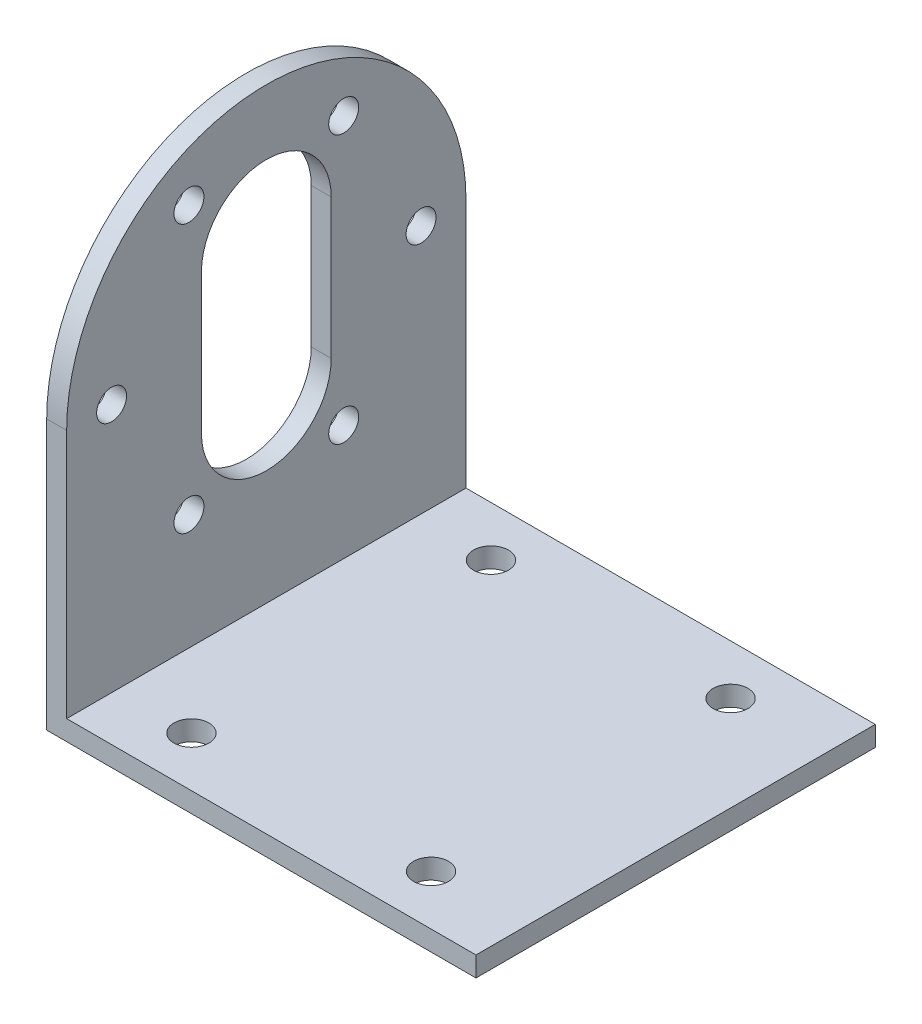
ISO-10303-21;
HEADER;
FILE_DESCRIPTION(('STEP AP214'),'2;1');
FILE_NAME('part.step','',(''),(''),'','','');
FILE_SCHEMA(('AUTOMOTIVE_DESIGN { 1 0 10303 214 1 1 1 1 }'));
ENDSEC;
DATA;
#1=APPLICATION_CONTEXT('core data for automotive mechanical design processes');
#2=APPLICATION_PROTOCOL_DEFINITION('international standard','automotive_design',2000,#1);
#3=PRODUCT_CONTEXT('',#1,'mechanical');
#4=PRODUCT('Part','Part','',(#3));
#5=PRODUCT_RELATED_PRODUCT_CATEGORY('part','',(#4));
#6=PRODUCT_DEFINITION_FORMATION('','',#4);
#7=PRODUCT_DEFINITION_CONTEXT('part definition',#1,'design');
#8=PRODUCT_DEFINITION('design','',#6,#7);
#9=PRODUCT_DEFINITION_SHAPE('','',#8);
#10=(LENGTH_UNIT() NAMED_UNIT(*) SI_UNIT(.MILLI.,.METRE.));
#11=(NAMED_UNIT(*) PLANE_ANGLE_UNIT() SI_UNIT($,.RADIAN.));
#12=(NAMED_UNIT(*) SI_UNIT($,.STERADIAN.) SOLID_ANGLE_UNIT());
#13=UNCERTAINTY_MEASURE_WITH_UNIT(LENGTH_MEASURE(1.E-05),#10,'distance_accuracy_value','');
#14=(GEOMETRIC_REPRESENTATION_CONTEXT(3) GLOBAL_UNCERTAINTY_ASSIGNED_CONTEXT((#13)) GLOBAL_UNIT_ASSIGNED_CONTEXT((#10,
#11,#12)) REPRESENTATION_CONTEXT('',''));
#15=CARTESIAN_POINT('',(0.,0.,0.));
#16=DIRECTION('',(0.,0.,1.));
#17=DIRECTION('',(1.,0.,0.));
#18=AXIS2_PLACEMENT_3D('',#15,#16,#17);
#19=CARTESIAN_POINT('',(2.,0.,0.));
#20=DIRECTION('',(1.,0.,0.));
#21=DIRECTION('',(0.,0.,-1.));
#22=AXIS2_PLACEMENT_3D('',#19,#20,#21);
#23=PLANE('',#22);
#24=CARTESIAN_POINT('',(2.,-13.4233937586589,-7.74999999999987));
#25=DIRECTION('',(1.,0.,0.));
#26=DIRECTION('',(0.,0.,-1.));
#27=AXIS2_PLACEMENT_3D('',#24,#25,#26);
#28=CIRCLE('',#27,1.5);
#29=CARTESIAN_POINT('',(2.,-13.4233937586589,-9.24999999999988));
#30=VERTEX_POINT('',#29);
#31=EDGE_CURVE('E164',#30,#30,#28,.T.);
#32=ORIENTED_EDGE('',*,*,#31,.F.);
#33=EDGE_LOOP('',(#32));
#34=FACE_BOUND('',#33,.T.);
#35=CARTESIAN_POINT('',(2.,13.4233937586588,-7.75000000000006));
#36=DIRECTION('',(1.,0.,0.));
#37=DIRECTION('',(0.,0.,-1.));
#38=AXIS2_PLACEMENT_3D('',#35,#36,#37);
#39=CIRCLE('',#38,1.5);
#40=CARTESIAN_POINT('',(2.,13.4233937586588,-9.25000000000006));
#41=VERTEX_POINT('',#40);
#42=EDGE_CURVE('E180',#41,#41,#39,.T.);
#43=ORIENTED_EDGE('',*,*,#42,.F.);
#44=EDGE_LOOP('',(#43));
#45=FACE_BOUND('',#44,.T.);
#46=DIRECTION('',(0.,-1.,0.));
#47=VECTOR('',#46,1.);
#48=CARTESIAN_POINT('',(2.,7.,6.5));
#49=LINE('',#48,#47);
#50=CARTESIAN_POINT('',(2.,7.,6.5));
#51=VERTEX_POINT('',#50);
#52=CARTESIAN_POINT('',(2.,-7.,6.5));
#53=VERTEX_POINT('',#52);
#54=EDGE_CURVE('E199',#51,#53,#49,.T.);
#55=ORIENTED_EDGE('',*,*,#54,.F.);
#56=CARTESIAN_POINT('',(2.,7.,0.));
#57=DIRECTION('',(1.,0.,0.));
#58=DIRECTION('',(0.,0.,-1.));
#59=AXIS2_PLACEMENT_3D('',#56,#57,#58);
#60=CIRCLE('',#59,6.5);
#61=CARTESIAN_POINT('',(2.,7.,-6.5));
#62=VERTEX_POINT('',#61);
#63=EDGE_CURVE('E196',#62,#51,#60,.T.);
#64=ORIENTED_EDGE('',*,*,#63,.F.);
#65=DIRECTION('',(0.,1.,0.));
#66=VECTOR('',#65,1.);
#67=CARTESIAN_POINT('',(2.,7.,-6.5));
#68=LINE('',#67,#66);
#69=CARTESIAN_POINT('',(2.,-7.,-6.5));
#70=VERTEX_POINT('',#69);
#71=EDGE_CURVE('E207',#70,#62,#68,.T.);
#72=ORIENTED_EDGE('',*,*,#71,.F.);
#73=CARTESIAN_POINT('',(2.,-7.,0.));
#74=DIRECTION('',(1.,0.,0.));
#75=DIRECTION('',(0.,0.,-1.));
#76=AXIS2_PLACEMENT_3D('',#73,#74,#75);
#77=CIRCLE('',#76,6.5);
#78=EDGE_CURVE('E203',#53,#70,#77,.T.);
#79=ORIENTED_EDGE('',*,*,#78,.F.);
#80=EDGE_LOOP('',(#55,#64,#72,#79));
#81=FACE_BOUND('',#80,.T.);
#82=CARTESIAN_POINT('',(2.,0.,15.5));
#83=DIRECTION('',(1.,0.,0.));
#84=DIRECTION('',(0.,0.,-1.));
#85=AXIS2_PLACEMENT_3D('',#82,#83,#84);
#86=CIRCLE('',#85,1.5);
#87=CARTESIAN_POINT('',(2.,0.,14.));
#88=VERTEX_POINT('',#87);
#89=EDGE_CURVE('E239',#88,#88,#86,.T.);
#90=ORIENTED_EDGE('',*,*,#89,.F.);
#91=EDGE_LOOP('',(#90));
#92=FACE_BOUND('',#91,.T.);
#93=CARTESIAN_POINT('',(2.,13.4233937586588,7.74999999999997));
#94=DIRECTION('',(1.,0.,0.));
#95=DIRECTION('',(0.,0.,-1.));
#96=AXIS2_PLACEMENT_3D('',#93,#94,#95);
#97=CIRCLE('',#96,1.5);
#98=CARTESIAN_POINT('',(2.,13.4233937586588,6.24999999999997));
#99=VERTEX_POINT('',#98);
#100=EDGE_CURVE('E188',#99,#99,#97,.T.);
#101=ORIENTED_EDGE('',*,*,#100,.F.);
#102=EDGE_LOOP('',(#101));
#103=FACE_BOUND('',#102,.T.);
#104=CARTESIAN_POINT('',(2.,-1.08235921504137E-13,-15.5));
#105=DIRECTION('',(1.,0.,0.));
#106=DIRECTION('',(0.,0.,-1.));
#107=AXIS2_PLACEMENT_3D('',#104,#105,#106);
#108=CIRCLE('',#107,1.5);
#109=CARTESIAN_POINT('',(2.,-1.08235921504137E-13,-17.));
#110=VERTEX_POINT('',#109);
#111=EDGE_CURVE('E172',#110,#110,#108,.T.);
#112=ORIENTED_EDGE('',*,*,#111,.F.);
#113=EDGE_LOOP('',(#112));
#114=FACE_BOUND('',#113,.T.);
#115=CARTESIAN_POINT('',(2.,-13.4233937586587,7.75000000000016));
#116=DIRECTION('',(1.,0.,0.));
#117=DIRECTION('',(0.,0.,-1.));
#118=AXIS2_PLACEMENT_3D('',#115,#116,#117);
#119=CIRCLE('',#118,1.5);
#120=CARTESIAN_POINT('',(2.,-13.4233937586587,6.25000000000015));
#121=VERTEX_POINT('',#120);
#122=EDGE_CURVE('E156',#121,#121,#119,.T.);
#123=ORIENTED_EDGE('',*,*,#122,.F.);
#124=EDGE_LOOP('',(#123));
#125=FACE_BOUND('',#124,.T.);
#126=DIRECTION('',(0.,-1.,0.));
#127=VECTOR('',#126,1.);
#128=CARTESIAN_POINT('',(2.,0.,20.));
#129=LINE('',#128,#127);
#130=CARTESIAN_POINT('',(2.,0.,20.));
#131=VERTEX_POINT('',#130);
#132=CARTESIAN_POINT('',(2.,-25.,20.));
#133=VERTEX_POINT('',#132);
#134=EDGE_CURVE('E55',#131,#133,#129,.T.);
#135=ORIENTED_EDGE('',*,*,#134,.T.);
#136=DIRECTION('',(0.,0.,-1.));
#137=VECTOR('',#136,1.);
#138=CARTESIAN_POINT('',(2.,-25.,0.));
#139=LINE('',#138,#137);
#140=CARTESIAN_POINT('',(2.,-25.,-20.));
#141=VERTEX_POINT('',#140);
#142=EDGE_CURVE('E59',#133,#141,#139,.T.);
#143=ORIENTED_EDGE('',*,*,#142,.T.);
#144=DIRECTION('',(0.,1.,0.));
#145=VECTOR('',#144,1.);
#146=CARTESIAN_POINT('',(2.,-27.,-20.));
#147=LINE('',#146,#145);
#148=CARTESIAN_POINT('',(2.,0.,-20.));
#149=VERTEX_POINT('',#148);
#150=EDGE_CURVE('E122',#141,#149,#147,.T.);
#151=ORIENTED_EDGE('',*,*,#150,.T.);
#152=CARTESIAN_POINT('',(2.,0.,0.));
#153=DIRECTION('',(1.,0.,0.));
#154=DIRECTION('',(0.,0.,-1.));
#155=AXIS2_PLACEMENT_3D('',#152,#153,#154);
#156=CIRCLE('',#155,20.);
#157=EDGE_CURVE('E247',#149,#131,#156,.T.);
#158=ORIENTED_EDGE('',*,*,#157,.T.);
#159=EDGE_LOOP('',(#135,#143,#151,#158));
#160=FACE_BOUND('',#159,.T.);
#161=ADVANCED_FACE('F39',(#34,#45,#81,#92,#103,#114,#125,#160),#23,.T.);
#162=CARTESIAN_POINT('',(0.,0.,0.));
#163=DIRECTION('',(1.,0.,0.));
#164=DIRECTION('',(0.,0.,-1.));
#165=AXIS2_PLACEMENT_3D('',#162,#163,#164);
#166=PLANE('',#165);
#167=DIRECTION('',(0.,0.,-1.));
#168=VECTOR('',#167,1.);
#169=CARTESIAN_POINT('',(0.,-27.,20.));
#170=LINE('',#169,#168);
#171=CARTESIAN_POINT('',(0.,-27.,20.));
#172=VERTEX_POINT('',#171);
#173=CARTESIAN_POINT('',(0.,-27.,-20.));
#174=VERTEX_POINT('',#173);
#175=EDGE_CURVE('E262',#172,#174,#170,.T.);
#176=ORIENTED_EDGE('',*,*,#175,.F.);
#177=DIRECTION('',(0.,-1.,0.));
#178=VECTOR('',#177,1.);
#179=CARTESIAN_POINT('',(0.,0.,20.));
#180=LINE('',#179,#178);
#181=CARTESIAN_POINT('',(0.,0.,20.));
#182=VERTEX_POINT('',#181);
#183=EDGE_CURVE('E259',#182,#172,#180,.T.);
#184=ORIENTED_EDGE('',*,*,#183,.F.);
#185=CARTESIAN_POINT('',(0.,0.,0.));
#186=DIRECTION('',(1.,0.,0.));
#187=DIRECTION('',(0.,0.,-1.));
#188=AXIS2_PLACEMENT_3D('',#185,#186,#187);
#189=CIRCLE('',#188,20.);
#190=CARTESIAN_POINT('',(0.,0.,-20.));
#191=VERTEX_POINT('',#190);
#192=EDGE_CURVE('E243',#191,#182,#189,.T.);
#193=ORIENTED_EDGE('',*,*,#192,.F.);
#194=DIRECTION('',(0.,1.,0.));
#195=VECTOR('',#194,1.);
#196=CARTESIAN_POINT('',(0.,-27.,-20.));
#197=LINE('',#196,#195);
#198=EDGE_CURVE('E250',#174,#191,#197,.T.);
#199=ORIENTED_EDGE('',*,*,#198,.F.);
#200=EDGE_LOOP('',(#176,#184,#193,#199));
#201=FACE_BOUND('',#200,.T.);
#202=CARTESIAN_POINT('',(0.,-13.4233937586587,7.75000000000016));
#203=DIRECTION('',(1.,0.,0.));
#204=DIRECTION('',(0.,0.,-1.));
#205=AXIS2_PLACEMENT_3D('',#202,#203,#204);
#206=CIRCLE('',#205,1.5);
#207=CARTESIAN_POINT('',(0.,-13.4233937586587,6.25000000000015));
#208=VERTEX_POINT('',#207);
#209=EDGE_CURVE('E155',#208,#208,#206,.T.);
#210=ORIENTED_EDGE('',*,*,#209,.T.);
#211=EDGE_LOOP('',(#210));
#212=FACE_BOUND('',#211,.T.);
#213=CARTESIAN_POINT('',(0.,-13.4233937586589,-7.74999999999987));
#214=DIRECTION('',(1.,0.,0.));
#215=DIRECTION('',(0.,0.,-1.));
#216=AXIS2_PLACEMENT_3D('',#213,#214,#215);
#217=CIRCLE('',#216,1.5);
#218=CARTESIAN_POINT('',(0.,-13.4233937586589,-9.24999999999988));
#219=VERTEX_POINT('',#218);
#220=EDGE_CURVE('E160',#219,#219,#217,.T.);
#221=ORIENTED_EDGE('',*,*,#220,.T.);
#222=EDGE_LOOP('',(#221));
#223=FACE_BOUND('',#222,.T.);
#224=CARTESIAN_POINT('',(0.,-1.08235921504137E-13,-15.5));
#225=DIRECTION('',(1.,0.,0.));
#226=DIRECTION('',(0.,0.,-1.));
#227=AXIS2_PLACEMENT_3D('',#224,#225,#226);
#228=CIRCLE('',#227,1.5);
#229=CARTESIAN_POINT('',(0.,-1.08235921504137E-13,-17.));
#230=VERTEX_POINT('',#229);
#231=EDGE_CURVE('E168',#230,#230,#228,.T.);
#232=ORIENTED_EDGE('',*,*,#231,.T.);
#233=EDGE_LOOP('',(#232));
#234=FACE_BOUND('',#233,.T.);
#235=CARTESIAN_POINT('',(0.,13.4233937586588,-7.75000000000006));
#236=DIRECTION('',(1.,0.,0.));
#237=DIRECTION('',(0.,0.,-1.));
#238=AXIS2_PLACEMENT_3D('',#235,#236,#237);
#239=CIRCLE('',#238,1.5);
#240=CARTESIAN_POINT('',(0.,13.4233937586588,-9.25000000000006));
#241=VERTEX_POINT('',#240);
#242=EDGE_CURVE('E176',#241,#241,#239,.T.);
#243=ORIENTED_EDGE('',*,*,#242,.T.);
#244=EDGE_LOOP('',(#243));
#245=FACE_BOUND('',#244,.T.);
#246=CARTESIAN_POINT('',(0.,13.4233937586588,7.74999999999997));
#247=DIRECTION('',(1.,0.,0.));
#248=DIRECTION('',(0.,0.,-1.));
#249=AXIS2_PLACEMENT_3D('',#246,#247,#248);
#250=CIRCLE('',#249,1.5);
#251=CARTESIAN_POINT('',(0.,13.4233937586588,6.24999999999997));
#252=VERTEX_POINT('',#251);
#253=EDGE_CURVE('E184',#252,#252,#250,.T.);
#254=ORIENTED_EDGE('',*,*,#253,.T.);
#255=EDGE_LOOP('',(#254));
#256=FACE_BOUND('',#255,.T.);
#257=CARTESIAN_POINT('',(0.,7.,0.));
#258=DIRECTION('',(1.,0.,0.));
#259=DIRECTION('',(0.,0.,-1.));
#260=AXIS2_PLACEMENT_3D('',#257,#258,#259);
#261=CIRCLE('',#260,6.5);
#262=CARTESIAN_POINT('',(0.,7.,-6.5));
#263=VERTEX_POINT('',#262);
#264=CARTESIAN_POINT('',(0.,7.,6.5));
#265=VERTEX_POINT('',#264);
#266=EDGE_CURVE('E192',#263,#265,#261,.T.);
#267=ORIENTED_EDGE('',*,*,#266,.T.);
#268=DIRECTION('',(0.,-1.,0.));
#269=VECTOR('',#268,1.);
#270=CARTESIAN_POINT('',(0.,7.,6.5));
#271=LINE('',#270,#269);
#272=CARTESIAN_POINT('',(0.,-7.,6.5));
#273=VERTEX_POINT('',#272);
#274=EDGE_CURVE('E214',#265,#273,#271,.T.);
#275=ORIENTED_EDGE('',*,*,#274,.T.);
#276=CARTESIAN_POINT('',(0.,-7.,0.));
#277=DIRECTION('',(1.,0.,0.));
#278=DIRECTION('',(0.,0.,-1.));
#279=AXIS2_PLACEMENT_3D('',#276,#277,#278);
#280=CIRCLE('',#279,6.5);
#281=CARTESIAN_POINT('',(0.,-7.,-6.5));
#282=VERTEX_POINT('',#281);
#283=EDGE_CURVE('E218',#273,#282,#280,.T.);
#284=ORIENTED_EDGE('',*,*,#283,.T.);
#285=DIRECTION('',(0.,1.,0.));
#286=VECTOR('',#285,1.);
#287=CARTESIAN_POINT('',(0.,7.,-6.5));
#288=LINE('',#287,#286);
#289=EDGE_CURVE('E200',#282,#263,#288,.T.);
#290=ORIENTED_EDGE('',*,*,#289,.T.);
#291=EDGE_LOOP('',(#267,#275,#284,#290));
#292=FACE_BOUND('',#291,.T.);
#293=CARTESIAN_POINT('',(0.,0.,15.5));
#294=DIRECTION('',(1.,0.,0.));
#295=DIRECTION('',(0.,0.,-1.));
#296=AXIS2_PLACEMENT_3D('',#293,#294,#295);
#297=CIRCLE('',#296,1.5);
#298=CARTESIAN_POINT('',(0.,0.,14.));
#299=VERTEX_POINT('',#298);
#300=EDGE_CURVE('E238',#299,#299,#297,.T.);
#301=ORIENTED_EDGE('',*,*,#300,.T.);
#302=EDGE_LOOP('',(#301));
#303=FACE_BOUND('',#302,.T.);
#304=ADVANCED_FACE('F281',(#201,#212,#223,#234,#245,#256,#292,#303),#166,.F.);
#305=CARTESIAN_POINT('',(2.,0.,0.));
#306=DIRECTION('',(-1.,0.,0.));
#307=DIRECTION('',(0.,0.,1.));
#308=AXIS2_PLACEMENT_3D('',#305,#306,#307);
#309=CYLINDRICAL_SURFACE('',#308,20.);
#310=ORIENTED_EDGE('',*,*,#192,.T.);
#311=DIRECTION('',(-1.,0.,0.));
#312=VECTOR('',#311,1.);
#313=CARTESIAN_POINT('',(2.,0.,20.));
#314=LINE('',#313,#312);
#315=EDGE_CURVE('E11',#131,#182,#314,.T.);
#316=ORIENTED_EDGE('',*,*,#315,.F.);
#317=ORIENTED_EDGE('',*,*,#157,.F.);
#318=DIRECTION('',(-1.,0.,0.));
#319=VECTOR('',#318,1.);
#320=CARTESIAN_POINT('',(2.,0.,-20.));
#321=LINE('',#320,#319);
#322=EDGE_CURVE('E255',#149,#191,#321,.T.);
#323=ORIENTED_EDGE('',*,*,#322,.T.);
#324=EDGE_LOOP('',(#310,#316,#317,#323));
#325=FACE_BOUND('',#324,.T.);
#326=ADVANCED_FACE('F41',(#325),#309,.T.);
#327=CARTESIAN_POINT('',(2.,0.,20.));
#328=DIRECTION('',(0.,0.,-1.));
#329=DIRECTION('',(-1.,0.,0.));
#330=AXIS2_PLACEMENT_3D('',#327,#328,#329);
#331=PLANE('',#330);
#332=DIRECTION('',(-1.,0.,0.));
#333=VECTOR('',#332,1.);
#334=CARTESIAN_POINT('',(2.,-27.,20.));
#335=LINE('',#334,#333);
#336=CARTESIAN_POINT('',(43.,-27.,20.));
#337=VERTEX_POINT('',#336);
#338=EDGE_CURVE('E48',#337,#172,#335,.T.);
#339=ORIENTED_EDGE('',*,*,#338,.F.);
#340=DIRECTION('',(0.,-1.,0.));
#341=VECTOR('',#340,1.);
#342=CARTESIAN_POINT('',(43.,-25.,20.));
#343=LINE('',#342,#341);
#344=CARTESIAN_POINT('',(43.,-25.,20.));
#345=VERTEX_POINT('',#344);
#346=EDGE_CURVE('E136',#345,#337,#343,.T.);
#347=ORIENTED_EDGE('',*,*,#346,.F.);
#348=DIRECTION('',(-1.,0.,0.));
#349=VECTOR('',#348,1.);
#350=CARTESIAN_POINT('',(0.,-25.,20.));
#351=LINE('',#350,#349);
#352=EDGE_CURVE('E137',#345,#133,#351,.T.);
#353=ORIENTED_EDGE('',*,*,#352,.T.);
#354=ORIENTED_EDGE('',*,*,#134,.F.);
#355=ORIENTED_EDGE('',*,*,#315,.T.);
#356=ORIENTED_EDGE('',*,*,#183,.T.);
#357=EDGE_LOOP('',(#339,#347,#353,#354,#355,#356));
#358=FACE_BOUND('',#357,.T.);
#359=ADVANCED_FACE('F303',(#358),#331,.F.);
#360=CARTESIAN_POINT('',(2.,-27.,20.));
#361=DIRECTION('',(0.,1.,0.));
#362=DIRECTION('',(0.,0.,1.));
#363=AXIS2_PLACEMENT_3D('',#360,#361,#362);
#364=PLANE('',#363);
#365=ORIENTED_EDGE('',*,*,#175,.T.);
#366=DIRECTION('',(-1.,0.,0.));
#367=VECTOR('',#366,1.);
#368=CARTESIAN_POINT('',(2.,-27.,-20.));
#369=LINE('',#368,#367);
#370=CARTESIAN_POINT('',(43.,-27.,-20.));
#371=VERTEX_POINT('',#370);
#372=EDGE_CURVE('E270',#371,#174,#369,.T.);
#373=ORIENTED_EDGE('',*,*,#372,.F.);
#374=DIRECTION('',(0.,0.,1.));
#375=VECTOR('',#374,1.);
#376=CARTESIAN_POINT('',(43.,-27.,20.));
#377=LINE('',#376,#375);
#378=EDGE_CURVE('E127',#371,#337,#377,.T.);
#379=ORIENTED_EDGE('',*,*,#378,.T.);
#380=ORIENTED_EDGE('',*,*,#338,.T.);
#381=EDGE_LOOP('',(#365,#373,#379,#380));
#382=FACE_BOUND('',#381,.T.);
#383=CARTESIAN_POINT('',(33.5,-27.,-15.));
#384=DIRECTION('',(0.,-1.,0.));
#385=DIRECTION('',(0.,0.,-1.));
#386=AXIS2_PLACEMENT_3D('',#383,#384,#385);
#387=CIRCLE('',#386,1.75);
#388=CARTESIAN_POINT('',(33.5,-27.,-16.75));
#389=VERTEX_POINT('',#388);
#390=EDGE_CURVE('E545',#389,#389,#387,.T.);
#391=ORIENTED_EDGE('',*,*,#390,.F.);
#392=EDGE_LOOP('',(#391));
#393=FACE_BOUND('',#392,.T.);
#394=CARTESIAN_POINT('',(33.5,-27.,15.));
#395=DIRECTION('',(0.,-1.,0.));
#396=DIRECTION('',(0.,0.,-1.));
#397=AXIS2_PLACEMENT_3D('',#394,#395,#396);
#398=CIRCLE('',#397,1.75);
#399=CARTESIAN_POINT('',(33.5,-27.,13.25));
#400=VERTEX_POINT('',#399);
#401=EDGE_CURVE('E549',#400,#400,#398,.T.);
#402=ORIENTED_EDGE('',*,*,#401,.F.);
#403=EDGE_LOOP('',(#402));
#404=FACE_BOUND('',#403,.T.);
#405=CARTESIAN_POINT('',(9.5,-27.,-15.));
#406=DIRECTION('',(0.,-1.,0.));
#407=DIRECTION('',(0.,0.,-1.));
#408=AXIS2_PLACEMENT_3D('',#405,#406,#407);
#409=CIRCLE('',#408,1.75);
#410=CARTESIAN_POINT('',(9.5,-27.,-16.75));
#411=VERTEX_POINT('',#410);
#412=EDGE_CURVE('E556',#411,#411,#409,.T.);
#413=ORIENTED_EDGE('',*,*,#412,.F.);
#414=EDGE_LOOP('',(#413));
#415=FACE_BOUND('',#414,.T.);
#416=CARTESIAN_POINT('',(9.5,-27.,15.));
#417=DIRECTION('',(0.,-1.,0.));
#418=DIRECTION('',(0.,0.,-1.));
#419=AXIS2_PLACEMENT_3D('',#416,#417,#418);
#420=CIRCLE('',#419,1.75);
#421=CARTESIAN_POINT('',(9.5,-27.,13.25));
#422=VERTEX_POINT('',#421);
#423=EDGE_CURVE('E564',#422,#422,#420,.T.);
#424=ORIENTED_EDGE('',*,*,#423,.F.);
#425=EDGE_LOOP('',(#424));
#426=FACE_BOUND('',#425,.T.);
#427=ADVANCED_FACE('F276',(#382,#393,#404,#415,#426),#364,.F.);
#428=CARTESIAN_POINT('',(2.,-27.,-20.));
#429=DIRECTION('',(0.,0.,1.));
#430=DIRECTION('',(1.,0.,0.));
#431=AXIS2_PLACEMENT_3D('',#428,#429,#430);
#432=PLANE('',#431);
#433=ORIENTED_EDGE('',*,*,#198,.T.);
#434=ORIENTED_EDGE('',*,*,#322,.F.);
#435=ORIENTED_EDGE('',*,*,#150,.F.);
#436=DIRECTION('',(1.,0.,0.));
#437=VECTOR('',#436,1.);
#438=CARTESIAN_POINT('',(0.,-25.,-20.));
#439=LINE('',#438,#437);
#440=CARTESIAN_POINT('',(43.,-25.,-20.));
#441=VERTEX_POINT('',#440);
#442=EDGE_CURVE('E115',#141,#441,#439,.T.);
#443=ORIENTED_EDGE('',*,*,#442,.T.);
#444=DIRECTION('',(0.,-1.,0.));
#445=VECTOR('',#444,1.);
#446=CARTESIAN_POINT('',(43.,-25.,-20.));
#447=LINE('',#446,#445);
#448=EDGE_CURVE('E119',#441,#371,#447,.T.);
#449=ORIENTED_EDGE('',*,*,#448,.T.);
#450=ORIENTED_EDGE('',*,*,#372,.T.);
#451=EDGE_LOOP('',(#433,#434,#435,#443,#449,#450));
#452=FACE_BOUND('',#451,.T.);
#453=ADVANCED_FACE('F117',(#452),#432,.F.);
#454=CARTESIAN_POINT('',(2.,0.,15.5));
#455=DIRECTION('',(-1.,0.,0.));
#456=DIRECTION('',(0.,0.,1.));
#457=AXIS2_PLACEMENT_3D('',#454,#455,#456);
#458=CYLINDRICAL_SURFACE('',#457,1.5);
#459=ORIENTED_EDGE('',*,*,#89,.T.);
#460=EDGE_LOOP('',(#459));
#461=FACE_BOUND('',#460,.T.);
#462=ORIENTED_EDGE('',*,*,#300,.F.);
#463=EDGE_LOOP('',(#462));
#464=FACE_BOUND('',#463,.T.);
#465=ADVANCED_FACE('F297',(#461,#464),#458,.F.);
#466=CARTESIAN_POINT('',(2.,7.,0.));
#467=DIRECTION('',(-1.,0.,0.));
#468=DIRECTION('',(0.,0.,1.));
#469=AXIS2_PLACEMENT_3D('',#466,#467,#468);
#470=CYLINDRICAL_SURFACE('',#469,6.5);
#471=ORIENTED_EDGE('',*,*,#266,.F.);
#472=DIRECTION('',(-1.,0.,0.));
#473=VECTOR('',#472,1.);
#474=CARTESIAN_POINT('',(2.,7.,-6.5));
#475=LINE('',#474,#473);
#476=EDGE_CURVE('E210',#62,#263,#475,.T.);
#477=ORIENTED_EDGE('',*,*,#476,.F.);
#478=ORIENTED_EDGE('',*,*,#63,.T.);
#479=DIRECTION('',(-1.,0.,0.));
#480=VECTOR('',#479,1.);
#481=CARTESIAN_POINT('',(2.,7.,6.5));
#482=LINE('',#481,#480);
#483=EDGE_CURVE('E234',#51,#265,#482,.T.);
#484=ORIENTED_EDGE('',*,*,#483,.T.);
#485=EDGE_LOOP('',(#471,#477,#478,#484));
#486=FACE_BOUND('',#485,.T.);
#487=ADVANCED_FACE('F431',(#486),#470,.F.);
#488=CARTESIAN_POINT('',(2.,7.,6.5));
#489=DIRECTION('',(0.,0.,-1.));
#490=DIRECTION('',(0.,1.,0.));
#491=AXIS2_PLACEMENT_3D('',#488,#489,#490);
#492=PLANE('',#491);
#493=ORIENTED_EDGE('',*,*,#274,.F.);
#494=ORIENTED_EDGE('',*,*,#483,.F.);
#495=ORIENTED_EDGE('',*,*,#54,.T.);
#496=DIRECTION('',(-1.,0.,0.));
#497=VECTOR('',#496,1.);
#498=CARTESIAN_POINT('',(2.,-7.,6.5));
#499=LINE('',#498,#497);
#500=EDGE_CURVE('E231',#53,#273,#499,.T.);
#501=ORIENTED_EDGE('',*,*,#500,.T.);
#502=EDGE_LOOP('',(#493,#494,#495,#501));
#503=FACE_BOUND('',#502,.T.);
#504=ADVANCED_FACE('F428',(#503),#492,.T.);
#505=CARTESIAN_POINT('',(2.,-7.,0.));
#506=DIRECTION('',(-1.,0.,0.));
#507=DIRECTION('',(0.,0.,1.));
#508=AXIS2_PLACEMENT_3D('',#505,#506,#507);
#509=CYLINDRICAL_SURFACE('',#508,6.5);
#510=ORIENTED_EDGE('',*,*,#283,.F.);
#511=ORIENTED_EDGE('',*,*,#500,.F.);
#512=ORIENTED_EDGE('',*,*,#78,.T.);
#513=DIRECTION('',(-1.,0.,0.));
#514=VECTOR('',#513,1.);
#515=CARTESIAN_POINT('',(2.,-7.,-6.5));
#516=LINE('',#515,#514);
#517=EDGE_CURVE('E228',#70,#282,#516,.T.);
#518=ORIENTED_EDGE('',*,*,#517,.T.);
#519=EDGE_LOOP('',(#510,#511,#512,#518));
#520=FACE_BOUND('',#519,.T.);
#521=ADVANCED_FACE('F424',(#520),#509,.F.);
#522=CARTESIAN_POINT('',(2.,7.,-6.5));
#523=DIRECTION('',(0.,0.,1.));
#524=DIRECTION('',(0.,-1.,0.));
#525=AXIS2_PLACEMENT_3D('',#522,#523,#524);
#526=PLANE('',#525);
#527=ORIENTED_EDGE('',*,*,#289,.F.);
#528=ORIENTED_EDGE('',*,*,#517,.F.);
#529=ORIENTED_EDGE('',*,*,#71,.T.);
#530=ORIENTED_EDGE('',*,*,#476,.T.);
#531=EDGE_LOOP('',(#527,#528,#529,#530));
#532=FACE_BOUND('',#531,.T.);
#533=ADVANCED_FACE('F420',(#532),#526,.T.);
#534=CARTESIAN_POINT('',(2.,13.4233937586588,7.74999999999997));
#535=DIRECTION('',(-1.,0.,0.));
#536=DIRECTION('',(0.,0.,1.));
#537=AXIS2_PLACEMENT_3D('',#534,#535,#536);
#538=CYLINDRICAL_SURFACE('',#537,1.5);
#539=ORIENTED_EDGE('',*,*,#100,.T.);
#540=EDGE_LOOP('',(#539));
#541=FACE_BOUND('',#540,.T.);
#542=ORIENTED_EDGE('',*,*,#253,.F.);
#543=EDGE_LOOP('',(#542));
#544=FACE_BOUND('',#543,.T.);
#545=ADVANCED_FACE('F416',(#541,#544),#538,.F.);
#546=CARTESIAN_POINT('',(2.,13.4233937586588,-7.75000000000006));
#547=DIRECTION('',(-1.,0.,0.));
#548=DIRECTION('',(0.,0.,1.));
#549=AXIS2_PLACEMENT_3D('',#546,#547,#548);
#550=CYLINDRICAL_SURFACE('',#549,1.5);
#551=ORIENTED_EDGE('',*,*,#42,.T.);
#552=EDGE_LOOP('',(#551));
#553=FACE_BOUND('',#552,.T.);
#554=ORIENTED_EDGE('',*,*,#242,.F.);
#555=EDGE_LOOP('',(#554));
#556=FACE_BOUND('',#555,.T.);
#557=ADVANCED_FACE('F412',(#553,#556),#550,.F.);
#558=CARTESIAN_POINT('',(2.,-1.08235921504137E-13,-15.5));
#559=DIRECTION('',(-1.,0.,0.));
#560=DIRECTION('',(0.,0.,1.));
#561=AXIS2_PLACEMENT_3D('',#558,#559,#560);
#562=CYLINDRICAL_SURFACE('',#561,1.5);
#563=ORIENTED_EDGE('',*,*,#111,.T.);
#564=EDGE_LOOP('',(#563));
#565=FACE_BOUND('',#564,.T.);
#566=ORIENTED_EDGE('',*,*,#231,.F.);
#567=EDGE_LOOP('',(#566));
#568=FACE_BOUND('',#567,.T.);
#569=ADVANCED_FACE('F408',(#565,#568),#562,.F.);
#570=CARTESIAN_POINT('',(2.,-13.4233937586589,-7.74999999999987));
#571=DIRECTION('',(-1.,0.,0.));
#572=DIRECTION('',(0.,0.,1.));
#573=AXIS2_PLACEMENT_3D('',#570,#571,#572);
#574=CYLINDRICAL_SURFACE('',#573,1.5);
#575=ORIENTED_EDGE('',*,*,#31,.T.);
#576=EDGE_LOOP('',(#575));
#577=FACE_BOUND('',#576,.T.);
#578=ORIENTED_EDGE('',*,*,#220,.F.);
#579=EDGE_LOOP('',(#578));
#580=FACE_BOUND('',#579,.T.);
#581=ADVANCED_FACE('F404',(#577,#580),#574,.F.);
#582=CARTESIAN_POINT('',(2.,-13.4233937586587,7.75000000000016));
#583=DIRECTION('',(-1.,0.,0.));
#584=DIRECTION('',(0.,0.,1.));
#585=AXIS2_PLACEMENT_3D('',#582,#583,#584);
#586=CYLINDRICAL_SURFACE('',#585,1.5);
#587=ORIENTED_EDGE('',*,*,#122,.T.);
#588=EDGE_LOOP('',(#587));
#589=FACE_BOUND('',#588,.T.);
#590=ORIENTED_EDGE('',*,*,#209,.F.);
#591=EDGE_LOOP('',(#590));
#592=FACE_BOUND('',#591,.T.);
#593=ADVANCED_FACE('F347',(#589,#592),#586,.F.);
#594=CARTESIAN_POINT('',(43.,-25.,20.));
#595=DIRECTION('',(1.,0.,0.));
#596=DIRECTION('',(0.,0.,-1.));
#597=AXIS2_PLACEMENT_3D('',#594,#595,#596);
#598=PLANE('',#597);
#599=ORIENTED_EDGE('',*,*,#378,.F.);
#600=ORIENTED_EDGE('',*,*,#448,.F.);
#601=DIRECTION('',(0.,0.,1.));
#602=VECTOR('',#601,1.);
#603=CARTESIAN_POINT('',(43.,-25.,20.));
#604=LINE('',#603,#602);
#605=EDGE_CURVE('E126',#441,#345,#604,.T.);
#606=ORIENTED_EDGE('',*,*,#605,.T.);
#607=ORIENTED_EDGE('',*,*,#346,.T.);
#608=EDGE_LOOP('',(#599,#600,#606,#607));
#609=FACE_BOUND('',#608,.T.);
#610=ADVANCED_FACE('F131',(#609),#598,.T.);
#611=CARTESIAN_POINT('',(0.,-25.,0.));
#612=DIRECTION('',(0.,-1.,0.));
#613=DIRECTION('',(0.,0.,-1.));
#614=AXIS2_PLACEMENT_3D('',#611,#612,#613);
#615=PLANE('',#614);
#616=ORIENTED_EDGE('',*,*,#142,.F.);
#617=ORIENTED_EDGE('',*,*,#352,.F.);
#618=ORIENTED_EDGE('',*,*,#605,.F.);
#619=ORIENTED_EDGE('',*,*,#442,.F.);
#620=EDGE_LOOP('',(#616,#617,#618,#619));
#621=FACE_BOUND('',#620,.T.);
#622=CARTESIAN_POINT('',(33.5,-25.,-15.));
#623=DIRECTION('',(0.,-1.,0.));
#624=DIRECTION('',(0.,0.,-1.));
#625=AXIS2_PLACEMENT_3D('',#622,#623,#624);
#626=CIRCLE('',#625,1.75);
#627=CARTESIAN_POINT('',(33.5,-25.,-16.75));
#628=VERTEX_POINT('',#627);
#629=EDGE_CURVE('E542',#628,#628,#626,.T.);
#630=ORIENTED_EDGE('',*,*,#629,.T.);
#631=EDGE_LOOP('',(#630));
#632=FACE_BOUND('',#631,.T.);
#633=CARTESIAN_POINT('',(33.5,-25.,15.));
#634=DIRECTION('',(0.,-1.,0.));
#635=DIRECTION('',(0.,0.,-1.));
#636=AXIS2_PLACEMENT_3D('',#633,#634,#635);
#637=CIRCLE('',#636,1.75);
#638=CARTESIAN_POINT('',(33.5,-25.,13.25));
#639=VERTEX_POINT('',#638);
#640=EDGE_CURVE('E552',#639,#639,#637,.T.);
#641=ORIENTED_EDGE('',*,*,#640,.T.);
#642=EDGE_LOOP('',(#641));
#643=FACE_BOUND('',#642,.T.);
#644=CARTESIAN_POINT('',(9.5,-25.,-15.));
#645=DIRECTION('',(0.,-1.,0.));
#646=DIRECTION('',(0.,0.,-1.));
#647=AXIS2_PLACEMENT_3D('',#644,#645,#646);
#648=CIRCLE('',#647,1.75);
#649=CARTESIAN_POINT('',(9.5,-25.,-16.75));
#650=VERTEX_POINT('',#649);
#651=EDGE_CURVE('E560',#650,#650,#648,.T.);
#652=ORIENTED_EDGE('',*,*,#651,.T.);
#653=EDGE_LOOP('',(#652));
#654=FACE_BOUND('',#653,.T.);
#655=CARTESIAN_POINT('',(9.5,-25.,15.));
#656=DIRECTION('',(0.,-1.,0.));
#657=DIRECTION('',(0.,0.,-1.));
#658=AXIS2_PLACEMENT_3D('',#655,#656,#657);
#659=CIRCLE('',#658,1.75);
#660=CARTESIAN_POINT('',(9.5,-25.,13.25));
#661=VERTEX_POINT('',#660);
#662=EDGE_CURVE('E150',#661,#661,#659,.T.);
#663=ORIENTED_EDGE('',*,*,#662,.T.);
#664=EDGE_LOOP('',(#663));
#665=FACE_BOUND('',#664,.T.);
#666=ADVANCED_FACE('F139',(#621,#632,#643,#654,#665),#615,.F.);
#667=CARTESIAN_POINT('',(9.5,-25.,15.));
#668=DIRECTION('',(0.,-1.,0.));
#669=DIRECTION('',(0.,0.,-1.));
#670=AXIS2_PLACEMENT_3D('',#667,#668,#669);
#671=CYLINDRICAL_SURFACE('',#670,1.75);
#672=ORIENTED_EDGE('',*,*,#662,.F.);
#673=EDGE_LOOP('',(#672));
#674=FACE_BOUND('',#673,.T.);
#675=ORIENTED_EDGE('',*,*,#423,.T.);
#676=EDGE_LOOP('',(#675));
#677=FACE_BOUND('',#676,.T.);
#678=ADVANCED_FACE('F357',(#674,#677),#671,.F.);
#679=CARTESIAN_POINT('',(9.5,-25.,-15.));
#680=DIRECTION('',(0.,-1.,0.));
#681=DIRECTION('',(0.,0.,-1.));
#682=AXIS2_PLACEMENT_3D('',#679,#680,#681);
#683=CYLINDRICAL_SURFACE('',#682,1.75);
#684=ORIENTED_EDGE('',*,*,#651,.F.);
#685=EDGE_LOOP('',(#684));
#686=FACE_BOUND('',#685,.T.);
#687=ORIENTED_EDGE('',*,*,#412,.T.);
#688=EDGE_LOOP('',(#687));
#689=FACE_BOUND('',#688,.T.);
#690=ADVANCED_FACE('F366',(#686,#689),#683,.F.);
#691=CARTESIAN_POINT('',(33.5,-25.,15.));
#692=DIRECTION('',(0.,-1.,0.));
#693=DIRECTION('',(0.,0.,-1.));
#694=AXIS2_PLACEMENT_3D('',#691,#692,#693);
#695=CYLINDRICAL_SURFACE('',#694,1.75);
#696=ORIENTED_EDGE('',*,*,#640,.F.);
#697=EDGE_LOOP('',(#696));
#698=FACE_BOUND('',#697,.T.);
#699=ORIENTED_EDGE('',*,*,#401,.T.);
#700=EDGE_LOOP('',(#699));
#701=FACE_BOUND('',#700,.T.);
#702=ADVANCED_FACE('F376',(#698,#701),#695,.F.);
#703=CARTESIAN_POINT('',(33.5,-25.,-15.));
#704=DIRECTION('',(0.,-1.,0.));
#705=DIRECTION('',(0.,0.,-1.));
#706=AXIS2_PLACEMENT_3D('',#703,#704,#705);
#707=CYLINDRICAL_SURFACE('',#706,1.75);
#708=ORIENTED_EDGE('',*,*,#629,.F.);
#709=EDGE_LOOP('',(#708));
#710=FACE_BOUND('',#709,.T.);
#711=ORIENTED_EDGE('',*,*,#390,.T.);
#712=EDGE_LOOP('',(#711));
#713=FACE_BOUND('',#712,.T.);
#714=ADVANCED_FACE('F386',(#710,#713),#707,.F.);
#715=CLOSED_SHELL('',(#161,#304,#326,#359,#427,#453,#465,#487,#504,#521,#533,#545,#557,#569,
#581,#593,#610,#666,#678,#690,#702,#714));
#716=MANIFOLD_SOLID_BREP('B2',#715);
#717=ADVANCED_BREP_SHAPE_REPRESENTATION('',(#18,#716),#14);
#718=SHAPE_DEFINITION_REPRESENTATION(#9,#717);
ENDSEC;
END-ISO-10303-21;
